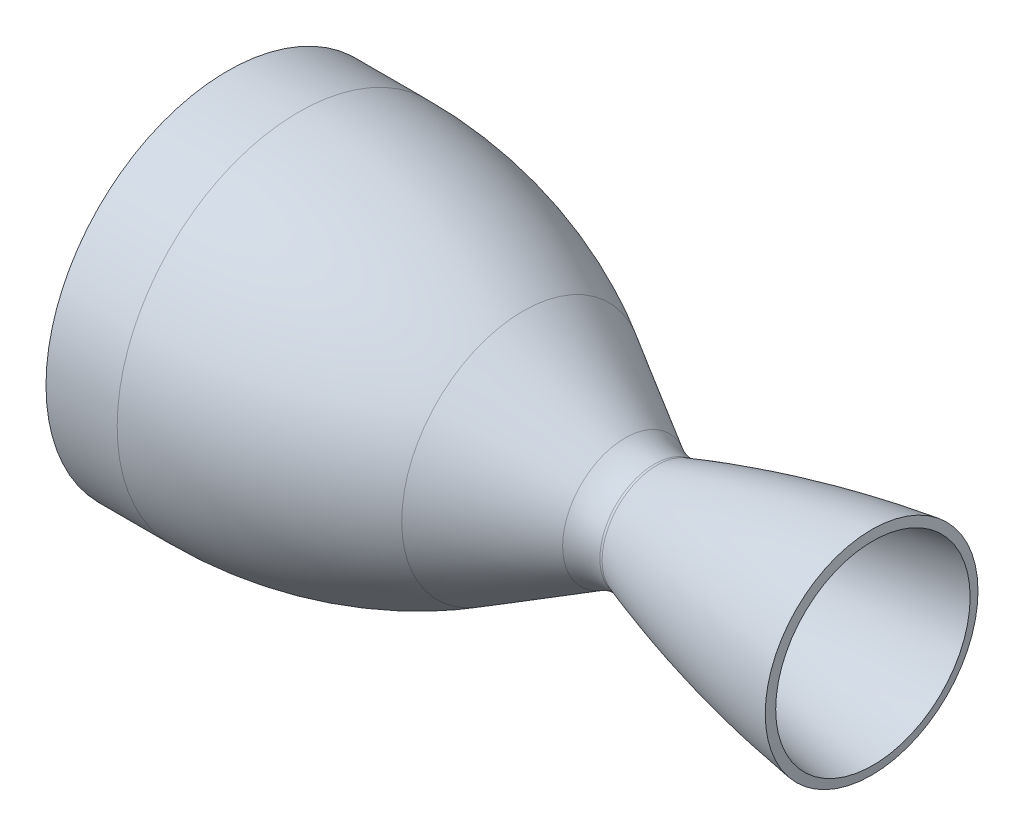
ISO-10303-21;
HEADER;
FILE_DESCRIPTION(('STEP AP214'),'2;1');
FILE_NAME('part.step','',(''),(''),'','','');
FILE_SCHEMA(('AUTOMOTIVE_DESIGN { 1 0 10303 214 1 1 1 1 }'));
ENDSEC;
DATA;
#1=APPLICATION_CONTEXT('core data for automotive mechanical design processes');
#2=APPLICATION_PROTOCOL_DEFINITION('international standard','automotive_design',2000,#1);
#3=PRODUCT_CONTEXT('',#1,'mechanical');
#4=PRODUCT('Part','Part','',(#3));
#5=PRODUCT_RELATED_PRODUCT_CATEGORY('part','',(#4));
#6=PRODUCT_DEFINITION_FORMATION('','',#4);
#7=PRODUCT_DEFINITION_CONTEXT('part definition',#1,'design');
#8=PRODUCT_DEFINITION('design','',#6,#7);
#9=PRODUCT_DEFINITION_SHAPE('','',#8);
#10=(LENGTH_UNIT() NAMED_UNIT(*) SI_UNIT(.MILLI.,.METRE.));
#11=(NAMED_UNIT(*) PLANE_ANGLE_UNIT() SI_UNIT($,.RADIAN.));
#12=(NAMED_UNIT(*) SI_UNIT($,.STERADIAN.) SOLID_ANGLE_UNIT());
#13=UNCERTAINTY_MEASURE_WITH_UNIT(LENGTH_MEASURE(1.E-05),#10,'distance_accuracy_value','');
#14=(GEOMETRIC_REPRESENTATION_CONTEXT(3) GLOBAL_UNCERTAINTY_ASSIGNED_CONTEXT((#13)) GLOBAL_UNIT_ASSIGNED_CONTEXT((#10,
#11,#12)) REPRESENTATION_CONTEXT('',''));
#15=CARTESIAN_POINT('',(0.,0.,0.));
#16=DIRECTION('',(0.,0.,1.));
#17=DIRECTION('',(1.,0.,0.));
#18=AXIS2_PLACEMENT_3D('',#15,#16,#17);
#19=CARTESIAN_POINT('',(237.757240536246,25.4514832566033,0.));
#20=CARTESIAN_POINT('',(294.7004774,45.0004942,0.));
#21=CARTESIAN_POINT('',(354.679631,53.4300176,0.));
#22=B_SPLINE_CURVE_WITH_KNOTS('',2,(#19,#20,#21),.UNSPECIFIED.,.F.,.F.,(3,3),(0.,1.),.UNSPECIFIED.);
#23=CARTESIAN_POINT('',(0.,0.,0.));
#24=DIRECTION('',(-1.,0.,0.));
#25=AXIS1_PLACEMENT('',#23,#24);
#26=SURFACE_OF_REVOLUTION('',#22,#25);
#27=CARTESIAN_POINT('',(354.679631,0.,0.));
#28=DIRECTION('',(-1.,0.,0.));
#29=DIRECTION('',(0.,0.,1.));
#30=AXIS2_PLACEMENT_3D('',#27,#28,#29);
#31=CIRCLE('',#30,53.4300176);
#32=CARTESIAN_POINT('',(354.679631,0.,53.4300176));
#33=VERTEX_POINT('',#32);
#34=EDGE_CURVE('E10',#33,#33,#31,.T.);
#35=ORIENTED_EDGE('',*,*,#34,.F.);
#36=EDGE_LOOP('',(#35));
#37=FACE_BOUND('',#36,.T.);
#38=CARTESIAN_POINT('',(237.757240536246,0.,0.));
#39=DIRECTION('',(-1.,0.,0.));
#40=DIRECTION('',(0.,0.,1.));
#41=AXIS2_PLACEMENT_3D('',#38,#39,#40);
#42=CIRCLE('',#41,25.4514832566015);
#43=CARTESIAN_POINT('',(237.757240536246,0.,25.4514832566015));
#44=VERTEX_POINT('',#43);
#45=EDGE_CURVE('E82',#44,#44,#42,.T.);
#46=ORIENTED_EDGE('',*,*,#45,.T.);
#47=EDGE_LOOP('',(#46));
#48=FACE_BOUND('',#47,.T.);
#49=ADVANCED_FACE('F35',(#37,#48),#26,.T.);
#50=CARTESIAN_POINT('',(354.679631,0.,0.));
#51=DIRECTION('',(-1.,0.,0.));
#52=DIRECTION('',(0.,0.,1.));
#53=AXIS2_PLACEMENT_3D('',#50,#51,#52);
#54=CONICAL_SURFACE('',#53,53.4300176,1.43116993614289);
#55=CARTESIAN_POINT('',(353.972631393117,0.,0.));
#56=DIRECTION('',(-1.,0.,0.));
#57=DIRECTION('',(0.,0.,1.));
#58=AXIS2_PLACEMENT_3D('',#55,#56,#57);
#59=CIRCLE('',#58,58.460579353509);
#60=CARTESIAN_POINT('',(353.972631393117,0.,58.460579353509));
#61=VERTEX_POINT('',#60);
#62=EDGE_CURVE('E42',#61,#61,#59,.T.);
#63=ORIENTED_EDGE('',*,*,#62,.F.);
#64=EDGE_LOOP('',(#63));
#65=FACE_BOUND('',#64,.T.);
#66=ORIENTED_EDGE('',*,*,#34,.T.);
#67=EDGE_LOOP('',(#66));
#68=FACE_BOUND('',#67,.T.);
#69=ADVANCED_FACE('F99',(#65,#68),#54,.T.);
#70=CARTESIAN_POINT('',(353.972631393117,58.460579353509,0.));
#71=CARTESIAN_POINT('',(293.514278695567,49.963883795525,0.));
#72=CARTESIAN_POINT('',(236.107739075268,30.2562251778965,0.));
#73=B_SPLINE_CURVE_WITH_KNOTS('',2,(#70,#71,#72),.UNSPECIFIED.,.F.,.F.,(3,3),(0.,1.),.UNSPECIFIED.);
#74=CARTESIAN_POINT('',(0.,0.,0.));
#75=DIRECTION('',(-1.,0.,0.));
#76=AXIS1_PLACEMENT('',#74,#75);
#77=SURFACE_OF_REVOLUTION('',#73,#76);
#78=CARTESIAN_POINT('',(236.107739075268,0.,0.));
#79=DIRECTION('',(-1.,0.,0.));
#80=DIRECTION('',(0.,0.,1.));
#81=AXIS2_PLACEMENT_3D('',#78,#79,#80);
#82=CIRCLE('',#81,30.2562251778959);
#83=CARTESIAN_POINT('',(236.107739075268,0.,30.2562251778959));
#84=VERTEX_POINT('',#83);
#85=EDGE_CURVE('E46',#84,#84,#82,.T.);
#86=ORIENTED_EDGE('',*,*,#85,.F.);
#87=EDGE_LOOP('',(#86));
#88=FACE_BOUND('',#87,.T.);
#89=ORIENTED_EDGE('',*,*,#62,.T.);
#90=EDGE_LOOP('',(#89));
#91=FACE_BOUND('',#90,.T.);
#92=ADVANCED_FACE('F95',(#88,#91),#77,.T.);
#93=CARTESIAN_POINT('',(234.6643262,0.,0.));
#94=DIRECTION('',(-1.,0.,0.));
#95=DIRECTION('',(0.,0.,1.));
#96=AXIS2_PLACEMENT_3D('',#93,#94,#95);
#97=TOROIDAL_SURFACE('',#96,34.4606626,4.44530479999732);
#98=CARTESIAN_POINT('',(234.664322528978,0.,0.));
#99=DIRECTION('',(-1.,0.,0.));
#100=DIRECTION('',(0.,0.,1.));
#101=AXIS2_PLACEMENT_3D('',#98,#99,#100);
#102=CIRCLE('',#101,30.0153578000042);
#103=CARTESIAN_POINT('',(234.664322528978,0.,30.0153578000042));
#104=VERTEX_POINT('',#103);
#105=EDGE_CURVE('E50',#104,#104,#102,.T.);
#106=ORIENTED_EDGE('',*,*,#105,.F.);
#107=EDGE_LOOP('',(#106));
#108=FACE_BOUND('',#107,.T.);
#109=ORIENTED_EDGE('',*,*,#85,.T.);
#110=EDGE_LOOP('',(#109));
#111=FACE_BOUND('',#110,.T.);
#112=ADVANCED_FACE('F98',(#108,#111),#97,.F.);
#113=CARTESIAN_POINT('',(234.664349221999,0.,0.));
#114=DIRECTION('',(-1.,0.,0.));
#115=DIRECTION('',(0.,0.,1.));
#116=AXIS2_PLACEMENT_3D('',#113,#114,#115);
#117=TOROIDAL_SURFACE('',#116,62.3384071999929,32.3230493999998);
#118=CARTESIAN_POINT('',(218.502822709652,0.,0.));
#119=DIRECTION('',(-1.,0.,0.));
#120=DIRECTION('',(0.,0.,1.));
#121=AXIS2_PLACEMENT_3D('',#118,#119,#120);
#122=CIRCLE('',#121,34.345826338174);
#123=CARTESIAN_POINT('',(218.502822709652,0.,34.345826338174));
#124=VERTEX_POINT('',#123);
#125=EDGE_CURVE('E55',#124,#124,#122,.T.);
#126=ORIENTED_EDGE('',*,*,#125,.F.);
#127=EDGE_LOOP('',(#126));
#128=FACE_BOUND('',#127,.T.);
#129=ORIENTED_EDGE('',*,*,#105,.T.);
#130=EDGE_LOOP('',(#129));
#131=FACE_BOUND('',#130,.T.);
#132=ADVANCED_FACE('F164',(#128,#131),#117,.F.);
#133=CARTESIAN_POINT('',(218.502822709652,0.,0.));
#134=DIRECTION('',(-1.,0.,0.));
#135=DIRECTION('',(0.,0.,1.));
#136=AXIS2_PLACEMENT_3D('',#133,#134,#135);
#137=CONICAL_SURFACE('',#136,34.345826338174,0.5235988403422);
#138=CARTESIAN_POINT('',(162.442972634409,0.,0.));
#139=DIRECTION('',(-1.,0.,0.));
#140=DIRECTION('',(0.,0.,1.));
#141=AXIS2_PLACEMENT_3D('',#138,#139,#140);
#142=CIRCLE('',#141,66.7120007092237);
#143=CARTESIAN_POINT('',(162.442972634409,0.,66.7120007092237));
#144=VERTEX_POINT('',#143);
#145=EDGE_CURVE('E58',#144,#144,#142,.T.);
#146=ORIENTED_EDGE('',*,*,#145,.F.);
#147=EDGE_LOOP('',(#146));
#148=FACE_BOUND('',#147,.T.);
#149=ORIENTED_EDGE('',*,*,#125,.T.);
#150=EDGE_LOOP('',(#149));
#151=FACE_BOUND('',#150,.T.);
#152=ADVANCED_FACE('F158',(#148,#151),#137,.T.);
#153=CARTESIAN_POINT('',(39.1107315039675,0.,0.));
#154=DIRECTION('',(-1.,0.,0.));
#155=DIRECTION('',(0.,0.,1.));
#156=AXIS2_PLACEMENT_3D('',#153,#154,#155);
#157=DEGENERATE_TOROIDAL_SURFACE('',#156,146.9056752,246.6644546,.F.);
#158=CARTESIAN_POINT('',(39.1107315039675,0.,0.));
#159=DIRECTION('',(-1.,0.,0.));
#160=DIRECTION('',(0.,0.,1.));
#161=AXIS2_PLACEMENT_3D('',#158,#159,#160);
#162=CIRCLE('',#161,99.7587794);
#163=CARTESIAN_POINT('',(39.1107315039675,0.,99.7587794));
#164=VERTEX_POINT('',#163);
#165=EDGE_CURVE('E61',#164,#164,#162,.T.);
#166=ORIENTED_EDGE('',*,*,#165,.F.);
#167=EDGE_LOOP('',(#166));
#168=FACE_BOUND('',#167,.T.);
#169=ORIENTED_EDGE('',*,*,#145,.T.);
#170=EDGE_LOOP('',(#169));
#171=FACE_BOUND('',#170,.T.);
#172=ADVANCED_FACE('F152',(#168,#171),#157,.F.);
#173=CARTESIAN_POINT('',(0.,0.,0.));
#174=DIRECTION('',(-1.,0.,0.));
#175=DIRECTION('',(0.,0.,1.));
#176=AXIS2_PLACEMENT_3D('',#173,#174,#175);
#177=CYLINDRICAL_SURFACE('',#176,99.7587794);
#178=CARTESIAN_POINT('',(0.,0.,0.));
#179=DIRECTION('',(-1.,0.,0.));
#180=DIRECTION('',(0.,0.,1.));
#181=AXIS2_PLACEMENT_3D('',#178,#179,#180);
#182=CIRCLE('',#181,99.7587794);
#183=CARTESIAN_POINT('',(0.,0.,99.7587794));
#184=VERTEX_POINT('',#183);
#185=EDGE_CURVE('E64',#184,#184,#182,.T.);
#186=ORIENTED_EDGE('',*,*,#185,.F.);
#187=EDGE_LOOP('',(#186));
#188=FACE_BOUND('',#187,.T.);
#189=ORIENTED_EDGE('',*,*,#165,.T.);
#190=EDGE_LOOP('',(#189));
#191=FACE_BOUND('',#190,.T.);
#192=ADVANCED_FACE('F146',(#188,#191),#177,.T.);
#193=CARTESIAN_POINT('',(0.,99.7587794,0.));
#194=DIRECTION('',(1.,0.,0.));
#195=DIRECTION('',(0.,0.,-1.));
#196=AXIS2_PLACEMENT_3D('',#193,#194,#195);
#197=PLANE('',#196);
#198=CARTESIAN_POINT('',(0.,0.,0.));
#199=DIRECTION('',(-1.,0.,0.));
#200=DIRECTION('',(0.,0.,1.));
#201=AXIS2_PLACEMENT_3D('',#198,#199,#200);
#202=CIRCLE('',#201,94.6787794);
#203=CARTESIAN_POINT('',(0.,0.,94.6787794));
#204=VERTEX_POINT('',#203);
#205=EDGE_CURVE('E67',#204,#204,#202,.T.);
#206=ORIENTED_EDGE('',*,*,#205,.F.);
#207=EDGE_LOOP('',(#206));
#208=FACE_BOUND('',#207,.T.);
#209=ORIENTED_EDGE('',*,*,#185,.T.);
#210=EDGE_LOOP('',(#209));
#211=FACE_BOUND('',#210,.T.);
#212=ADVANCED_FACE('F140',(#208,#211),#197,.F.);
#213=CARTESIAN_POINT('',(0.,0.,0.));
#214=DIRECTION('',(-1.,0.,0.));
#215=DIRECTION('',(0.,0.,1.));
#216=AXIS2_PLACEMENT_3D('',#213,#214,#215);
#217=CYLINDRICAL_SURFACE('',#216,94.6787793999999);
#218=CARTESIAN_POINT('',(39.1107315039675,0.,0.));
#219=DIRECTION('',(-1.,0.,0.));
#220=DIRECTION('',(0.,0.,1.));
#221=AXIS2_PLACEMENT_3D('',#218,#219,#220);
#222=CIRCLE('',#221,94.6787793999999);
#223=CARTESIAN_POINT('',(39.1107315039675,0.,94.6787793999999));
#224=VERTEX_POINT('',#223);
#225=EDGE_CURVE('E70',#224,#224,#222,.T.);
#226=ORIENTED_EDGE('',*,*,#225,.F.);
#227=EDGE_LOOP('',(#226));
#228=FACE_BOUND('',#227,.T.);
#229=ORIENTED_EDGE('',*,*,#205,.T.);
#230=EDGE_LOOP('',(#229));
#231=FACE_BOUND('',#230,.T.);
#232=ADVANCED_FACE('F134',(#228,#231),#217,.F.);
#233=CARTESIAN_POINT('',(39.1107315039675,0.,0.));
#234=DIRECTION('',(-1.,0.,0.));
#235=DIRECTION('',(0.,0.,1.));
#236=AXIS2_PLACEMENT_3D('',#233,#234,#235);
#237=DEGENERATE_TOROIDAL_SURFACE('',#236,146.9056752,241.584454599999,.F.);
#238=CARTESIAN_POINT('',(159.902972349574,0.,0.));
#239=DIRECTION('',(-1.,0.,0.));
#240=DIRECTION('',(0.,0.,1.));
#241=AXIS2_PLACEMENT_3D('',#238,#239,#240);
#242=CIRCLE('',#241,62.312591822448);
#243=CARTESIAN_POINT('',(159.902972349574,0.,62.312591822448));
#244=VERTEX_POINT('',#243);
#245=EDGE_CURVE('E73',#244,#244,#242,.T.);
#246=ORIENTED_EDGE('',*,*,#245,.F.);
#247=EDGE_LOOP('',(#246));
#248=FACE_BOUND('',#247,.T.);
#249=ORIENTED_EDGE('',*,*,#225,.T.);
#250=EDGE_LOOP('',(#249));
#251=FACE_BOUND('',#250,.T.);
#252=ADVANCED_FACE('F128',(#248,#251),#237,.T.);
#253=CARTESIAN_POINT('',(159.902972349574,0.,0.));
#254=DIRECTION('',(-1.,0.,0.));
#255=DIRECTION('',(0.,0.,1.));
#256=AXIS2_PLACEMENT_3D('',#253,#254,#255);
#257=CONICAL_SURFACE('',#256,62.312591822448,0.5235988403422);
#258=CARTESIAN_POINT('',(215.962822424817,0.,0.));
#259=DIRECTION('',(-1.,0.,0.));
#260=DIRECTION('',(0.,0.,1.));
#261=AXIS2_PLACEMENT_3D('',#258,#259,#260);
#262=CIRCLE('',#261,29.9464174513984);
#263=CARTESIAN_POINT('',(215.962822424817,0.,29.9464174513984));
#264=VERTEX_POINT('',#263);
#265=EDGE_CURVE('E76',#264,#264,#262,.T.);
#266=ORIENTED_EDGE('',*,*,#265,.F.);
#267=EDGE_LOOP('',(#266));
#268=FACE_BOUND('',#267,.T.);
#269=ORIENTED_EDGE('',*,*,#245,.T.);
#270=EDGE_LOOP('',(#269));
#271=FACE_BOUND('',#270,.T.);
#272=ADVANCED_FACE('F122',(#268,#271),#257,.F.);
#273=CARTESIAN_POINT('',(234.664349221999,0.,0.));
#274=DIRECTION('',(-1.,0.,0.));
#275=DIRECTION('',(0.,0.,1.));
#276=AXIS2_PLACEMENT_3D('',#273,#274,#275);
#277=TOROIDAL_SURFACE('',#276,62.3384071999929,37.4030493999994);
#278=CARTESIAN_POINT('',(234.664318333813,0.,0.));
#279=DIRECTION('',(-1.,0.,0.));
#280=DIRECTION('',(0.,0.,1.));
#281=AXIS2_PLACEMENT_3D('',#278,#279,#280);
#282=CIRCLE('',#281,24.9353578000046);
#283=CARTESIAN_POINT('',(234.664318333813,0.,24.9353578000046));
#284=VERTEX_POINT('',#283);
#285=EDGE_CURVE('E79',#284,#284,#282,.T.);
#286=ORIENTED_EDGE('',*,*,#285,.F.);
#287=EDGE_LOOP('',(#286));
#288=FACE_BOUND('',#287,.T.);
#289=ORIENTED_EDGE('',*,*,#265,.T.);
#290=EDGE_LOOP('',(#289));
#291=FACE_BOUND('',#290,.T.);
#292=ADVANCED_FACE('F116',(#288,#291),#277,.T.);
#293=CARTESIAN_POINT('',(234.6643262,0.,0.));
#294=DIRECTION('',(-1.,0.,0.));
#295=DIRECTION('',(0.,0.,1.));
#296=AXIS2_PLACEMENT_3D('',#293,#294,#295);
#297=TOROIDAL_SURFACE('',#296,34.4606626,9.5253047999986);
#298=ORIENTED_EDGE('',*,*,#45,.F.);
#299=EDGE_LOOP('',(#298));
#300=FACE_BOUND('',#299,.T.);
#301=ORIENTED_EDGE('',*,*,#285,.T.);
#302=EDGE_LOOP('',(#301));
#303=FACE_BOUND('',#302,.T.);
#304=ADVANCED_FACE('F113',(#300,#303),#297,.T.);
#305=CLOSED_SHELL('',(#49,#69,#92,#112,#132,#152,#172,#192,#212,#232,#252,#272,#292,#304));
#306=MANIFOLD_SOLID_BREP('B2',#305);
#307=ADVANCED_BREP_SHAPE_REPRESENTATION('',(#18,#306),#14);
#308=SHAPE_DEFINITION_REPRESENTATION(#9,#307);
ENDSEC;
END-ISO-10303-21;
